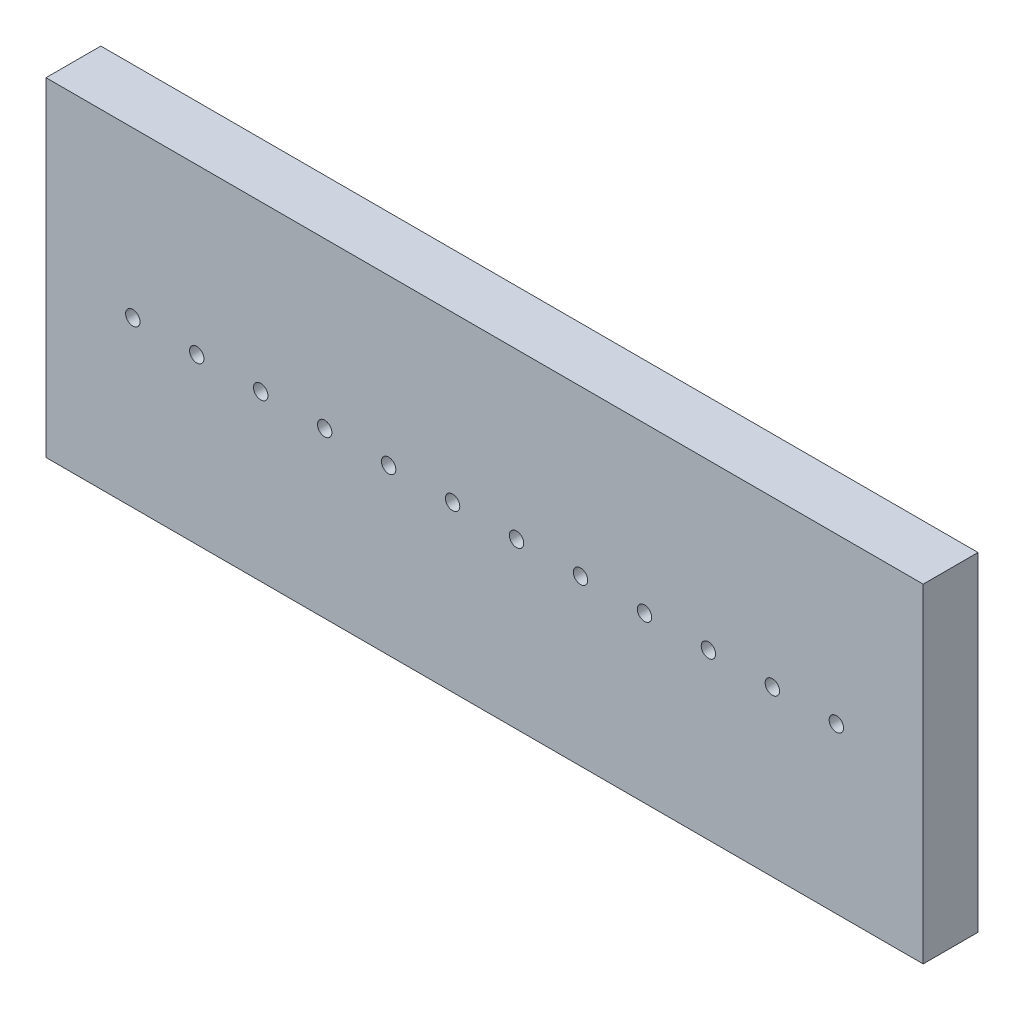
ISO-10303-21;
HEADER;
FILE_DESCRIPTION(('STEP AP214'),'2;1');
FILE_NAME('part.step','',(''),(''),'','','');
FILE_SCHEMA(('AUTOMOTIVE_DESIGN { 1 0 10303 214 1 1 1 1 }'));
ENDSEC;
DATA;
#1=APPLICATION_CONTEXT('core data for automotive mechanical design processes');
#2=APPLICATION_PROTOCOL_DEFINITION('international standard','automotive_design',2000,#1);
#3=PRODUCT_CONTEXT('',#1,'mechanical');
#4=PRODUCT('Part','Part','',(#3));
#5=PRODUCT_RELATED_PRODUCT_CATEGORY('part','',(#4));
#6=PRODUCT_DEFINITION_FORMATION('','',#4);
#7=PRODUCT_DEFINITION_CONTEXT('part definition',#1,'design');
#8=PRODUCT_DEFINITION('design','',#6,#7);
#9=PRODUCT_DEFINITION_SHAPE('','',#8);
#10=(LENGTH_UNIT() NAMED_UNIT(*) SI_UNIT(.MILLI.,.METRE.));
#11=(NAMED_UNIT(*) PLANE_ANGLE_UNIT() SI_UNIT($,.RADIAN.));
#12=(NAMED_UNIT(*) SI_UNIT($,.STERADIAN.) SOLID_ANGLE_UNIT());
#13=UNCERTAINTY_MEASURE_WITH_UNIT(LENGTH_MEASURE(1.E-05),#10,'distance_accuracy_value','');
#14=(GEOMETRIC_REPRESENTATION_CONTEXT(3) GLOBAL_UNCERTAINTY_ASSIGNED_CONTEXT((#13)) GLOBAL_UNIT_ASSIGNED_CONTEXT((#10,
#11,#12)) REPRESENTATION_CONTEXT('',''));
#15=CARTESIAN_POINT('',(0.,0.,0.));
#16=DIRECTION('',(0.,0.,1.));
#17=DIRECTION('',(1.,0.,0.));
#18=AXIS2_PLACEMENT_3D('',#15,#16,#17);
#19=CARTESIAN_POINT('',(101.6,-38.1,12.7));
#20=DIRECTION('',(-1.,0.,0.));
#21=DIRECTION('',(0.,0.,1.));
#22=AXIS2_PLACEMENT_3D('',#19,#20,#21);
#23=PLANE('',#22);
#24=DIRECTION('',(0.,1.,0.));
#25=VECTOR('',#24,1.);
#26=CARTESIAN_POINT('',(101.6,-38.1,0.));
#27=LINE('',#26,#25);
#28=CARTESIAN_POINT('',(101.6,-38.1,0.));
#29=VERTEX_POINT('',#28);
#30=CARTESIAN_POINT('',(101.6,38.1,0.));
#31=VERTEX_POINT('',#30);
#32=EDGE_CURVE('E96',#29,#31,#27,.T.);
#33=ORIENTED_EDGE('',*,*,#32,.T.);
#34=DIRECTION('',(0.,0.,-1.));
#35=VECTOR('',#34,1.);
#36=CARTESIAN_POINT('',(101.6,38.1,12.7));
#37=LINE('',#36,#35);
#38=CARTESIAN_POINT('',(101.6,38.1,12.7));
#39=VERTEX_POINT('',#38);
#40=EDGE_CURVE('E11',#39,#31,#37,.T.);
#41=ORIENTED_EDGE('',*,*,#40,.F.);
#42=DIRECTION('',(0.,1.,0.));
#43=VECTOR('',#42,1.);
#44=CARTESIAN_POINT('',(101.6,-38.1,12.7));
#45=LINE('',#44,#43);
#46=CARTESIAN_POINT('',(101.6,-38.1,12.7));
#47=VERTEX_POINT('',#46);
#48=EDGE_CURVE('E84',#47,#39,#45,.T.);
#49=ORIENTED_EDGE('',*,*,#48,.F.);
#50=DIRECTION('',(0.,0.,-1.));
#51=VECTOR('',#50,1.);
#52=CARTESIAN_POINT('',(101.6,-38.1,12.7));
#53=LINE('',#52,#51);
#54=EDGE_CURVE('E92',#47,#29,#53,.T.);
#55=ORIENTED_EDGE('',*,*,#54,.T.);
#56=EDGE_LOOP('',(#33,#41,#49,#55));
#57=FACE_BOUND('',#56,.T.);
#58=ADVANCED_FACE('F33',(#57),#23,.F.);
#59=CARTESIAN_POINT('',(-101.6,38.1,12.7));
#60=DIRECTION('',(0.,-1.,0.));
#61=DIRECTION('',(0.,0.,-1.));
#62=AXIS2_PLACEMENT_3D('',#59,#60,#61);
#63=PLANE('',#62);
#64=DIRECTION('',(-1.,0.,0.));
#65=VECTOR('',#64,1.);
#66=CARTESIAN_POINT('',(-101.6,38.1,0.));
#67=LINE('',#66,#65);
#68=CARTESIAN_POINT('',(-101.6,38.1,0.));
#69=VERTEX_POINT('',#68);
#70=EDGE_CURVE('E88',#31,#69,#67,.T.);
#71=ORIENTED_EDGE('',*,*,#70,.T.);
#72=DIRECTION('',(0.,0.,-1.));
#73=VECTOR('',#72,1.);
#74=CARTESIAN_POINT('',(-101.6,38.1,12.7));
#75=LINE('',#74,#73);
#76=CARTESIAN_POINT('',(-101.6,38.1,12.7));
#77=VERTEX_POINT('',#76);
#78=EDGE_CURVE('E41',#77,#69,#75,.T.);
#79=ORIENTED_EDGE('',*,*,#78,.F.);
#80=DIRECTION('',(-1.,0.,0.));
#81=VECTOR('',#80,1.);
#82=CARTESIAN_POINT('',(-101.6,38.1,12.7));
#83=LINE('',#82,#81);
#84=EDGE_CURVE('E79',#39,#77,#83,.T.);
#85=ORIENTED_EDGE('',*,*,#84,.F.);
#86=ORIENTED_EDGE('',*,*,#40,.T.);
#87=EDGE_LOOP('',(#71,#79,#85,#86));
#88=FACE_BOUND('',#87,.T.);
#89=ADVANCED_FACE('F87',(#88),#63,.F.);
#90=CARTESIAN_POINT('',(-101.6,-38.1,12.7));
#91=DIRECTION('',(1.,0.,0.));
#92=DIRECTION('',(0.,0.,-1.));
#93=AXIS2_PLACEMENT_3D('',#90,#91,#92);
#94=PLANE('',#93);
#95=DIRECTION('',(0.,-1.,0.));
#96=VECTOR('',#95,1.);
#97=CARTESIAN_POINT('',(-101.6,-38.1,0.));
#98=LINE('',#97,#96);
#99=CARTESIAN_POINT('',(-101.6,-38.1,0.));
#100=VERTEX_POINT('',#99);
#101=EDGE_CURVE('E66',#69,#100,#98,.T.);
#102=ORIENTED_EDGE('',*,*,#101,.T.);
#103=DIRECTION('',(0.,0.,-1.));
#104=VECTOR('',#103,1.);
#105=CARTESIAN_POINT('',(-101.6,-38.1,12.7));
#106=LINE('',#105,#104);
#107=CARTESIAN_POINT('',(-101.6,-38.1,12.7));
#108=VERTEX_POINT('',#107);
#109=EDGE_CURVE('E89',#108,#100,#106,.T.);
#110=ORIENTED_EDGE('',*,*,#109,.F.);
#111=DIRECTION('',(0.,-1.,0.));
#112=VECTOR('',#111,1.);
#113=CARTESIAN_POINT('',(-101.6,-38.1,12.7));
#114=LINE('',#113,#112);
#115=EDGE_CURVE('E82',#77,#108,#114,.T.);
#116=ORIENTED_EDGE('',*,*,#115,.F.);
#117=ORIENTED_EDGE('',*,*,#78,.T.);
#118=EDGE_LOOP('',(#102,#110,#116,#117));
#119=FACE_BOUND('',#118,.T.);
#120=ADVANCED_FACE('F90',(#119),#94,.F.);
#121=CARTESIAN_POINT('',(-101.6,-38.1,12.7));
#122=DIRECTION('',(0.,1.,0.));
#123=DIRECTION('',(0.,0.,1.));
#124=AXIS2_PLACEMENT_3D('',#121,#122,#123);
#125=PLANE('',#124);
#126=DIRECTION('',(1.,0.,0.));
#127=VECTOR('',#126,1.);
#128=CARTESIAN_POINT('',(-101.6,-38.1,0.));
#129=LINE('',#128,#127);
#130=EDGE_CURVE('E72',#100,#29,#129,.T.);
#131=ORIENTED_EDGE('',*,*,#130,.T.);
#132=ORIENTED_EDGE('',*,*,#54,.F.);
#133=DIRECTION('',(1.,0.,0.));
#134=VECTOR('',#133,1.);
#135=CARTESIAN_POINT('',(-101.6,-38.1,12.7));
#136=LINE('',#135,#134);
#137=EDGE_CURVE('E49',#108,#47,#136,.T.);
#138=ORIENTED_EDGE('',*,*,#137,.F.);
#139=ORIENTED_EDGE('',*,*,#109,.T.);
#140=EDGE_LOOP('',(#131,#132,#138,#139));
#141=FACE_BOUND('',#140,.T.);
#142=ADVANCED_FACE('F104',(#141),#125,.F.);
#143=CARTESIAN_POINT('',(0.,0.,12.7));
#144=DIRECTION('',(0.,0.,-1.));
#145=DIRECTION('',(-1.,0.,0.));
#146=AXIS2_PLACEMENT_3D('',#143,#144,#145);
#147=PLANE('',#146);
#148=CARTESIAN_POINT('',(81.4819299999999,0.,12.7));
#149=DIRECTION('',(0.,0.,-1.));
#150=DIRECTION('',(-1.,0.,0.));
#151=AXIS2_PLACEMENT_3D('',#148,#149,#150);
#152=CIRCLE('',#151,1.66687499999962);
#153=CARTESIAN_POINT('',(79.8150550000003,0.,12.7));
#154=VERTEX_POINT('',#153);
#155=EDGE_CURVE('E173',#154,#154,#152,.T.);
#156=ORIENTED_EDGE('',*,*,#155,.T.);
#157=EDGE_LOOP('',(#156));
#158=FACE_BOUND('',#157,.T.);
#159=CARTESIAN_POINT('',(66.66611,-1.02764428708927E-12,12.7));
#160=DIRECTION('',(0.,0.,-1.));
#161=DIRECTION('',(-1.,0.,0.));
#162=AXIS2_PLACEMENT_3D('',#159,#160,#161);
#163=CIRCLE('',#162,1.666875);
#164=CARTESIAN_POINT('',(64.999235,-1.02764428708927E-12,12.7));
#165=VERTEX_POINT('',#164);
#166=EDGE_CURVE('E167',#165,#165,#163,.T.);
#167=ORIENTED_EDGE('',*,*,#166,.T.);
#168=EDGE_LOOP('',(#167));
#169=FACE_BOUND('',#168,.T.);
#170=CARTESIAN_POINT('',(51.85029,-9.24185968989952E-13,12.7));
#171=DIRECTION('',(0.,0.,-1.));
#172=DIRECTION('',(-1.,0.,0.));
#173=AXIS2_PLACEMENT_3D('',#170,#171,#172);
#174=CIRCLE('',#173,1.666875);
#175=CARTESIAN_POINT('',(50.183415,-9.24185968989952E-13,12.7));
#176=VERTEX_POINT('',#175);
#177=EDGE_CURVE('E161',#176,#176,#174,.T.);
#178=ORIENTED_EDGE('',*,*,#177,.T.);
#179=EDGE_LOOP('',(#178));
#180=FACE_BOUND('',#179,.T.);
#181=CARTESIAN_POINT('',(37.03447,-8.20727650890635E-13,12.7));
#182=DIRECTION('',(0.,0.,-1.));
#183=DIRECTION('',(-1.,0.,0.));
#184=AXIS2_PLACEMENT_3D('',#181,#182,#183);
#185=CIRCLE('',#184,1.666875);
#186=CARTESIAN_POINT('',(35.367595,-8.20727650890635E-13,12.7));
#187=VERTEX_POINT('',#186);
#188=EDGE_CURVE('E155',#187,#187,#185,.T.);
#189=ORIENTED_EDGE('',*,*,#188,.T.);
#190=EDGE_LOOP('',(#189));
#191=FACE_BOUND('',#190,.T.);
#192=CARTESIAN_POINT('',(22.21865,-7.17269332791317E-13,12.7));
#193=DIRECTION('',(0.,0.,-1.));
#194=DIRECTION('',(-1.,0.,0.));
#195=AXIS2_PLACEMENT_3D('',#192,#193,#194);
#196=CIRCLE('',#195,1.666875);
#197=CARTESIAN_POINT('',(20.551775,-7.17269332791317E-13,12.7));
#198=VERTEX_POINT('',#197);
#199=EDGE_CURVE('E149',#198,#198,#196,.T.);
#200=ORIENTED_EDGE('',*,*,#199,.T.);
#201=EDGE_LOOP('',(#200));
#202=FACE_BOUND('',#201,.T.);
#203=CARTESIAN_POINT('',(7.40283,-6.13811014691999E-13,12.7));
#204=DIRECTION('',(0.,0.,-1.));
#205=DIRECTION('',(-1.,0.,0.));
#206=AXIS2_PLACEMENT_3D('',#203,#204,#205);
#207=CIRCLE('',#206,1.666875);
#208=CARTESIAN_POINT('',(5.735955,-6.13811014691999E-13,12.7));
#209=VERTEX_POINT('',#208);
#210=EDGE_CURVE('E143',#209,#209,#207,.T.);
#211=ORIENTED_EDGE('',*,*,#210,.T.);
#212=EDGE_LOOP('',(#211));
#213=FACE_BOUND('',#212,.T.);
#214=CARTESIAN_POINT('',(-7.41298999999999,-5.10352696592681E-13,12.7));
#215=DIRECTION('',(0.,0.,-1.));
#216=DIRECTION('',(-1.,0.,0.));
#217=AXIS2_PLACEMENT_3D('',#214,#215,#216);
#218=CIRCLE('',#217,1.666875);
#219=CARTESIAN_POINT('',(-9.079865,-5.10352696592681E-13,12.7));
#220=VERTEX_POINT('',#219);
#221=EDGE_CURVE('E137',#220,#220,#218,.T.);
#222=ORIENTED_EDGE('',*,*,#221,.T.);
#223=EDGE_LOOP('',(#222));
#224=FACE_BOUND('',#223,.T.);
#225=CARTESIAN_POINT('',(-22.22881,-4.06894378493364E-13,12.7));
#226=DIRECTION('',(0.,0.,-1.));
#227=DIRECTION('',(-1.,0.,0.));
#228=AXIS2_PLACEMENT_3D('',#225,#226,#227);
#229=CIRCLE('',#228,1.666875);
#230=CARTESIAN_POINT('',(-23.895685,-4.06894378493364E-13,12.7));
#231=VERTEX_POINT('',#230);
#232=EDGE_CURVE('E131',#231,#231,#229,.T.);
#233=ORIENTED_EDGE('',*,*,#232,.T.);
#234=EDGE_LOOP('',(#233));
#235=FACE_BOUND('',#234,.T.);
#236=CARTESIAN_POINT('',(-37.04463,-3.03436060394046E-13,12.7));
#237=DIRECTION('',(0.,0.,-1.));
#238=DIRECTION('',(-1.,0.,0.));
#239=AXIS2_PLACEMENT_3D('',#236,#237,#238);
#240=CIRCLE('',#239,1.666875);
#241=CARTESIAN_POINT('',(-38.711505,-3.03436060394046E-13,12.7));
#242=VERTEX_POINT('',#241);
#243=EDGE_CURVE('E125',#242,#242,#240,.T.);
#244=ORIENTED_EDGE('',*,*,#243,.T.);
#245=EDGE_LOOP('',(#244));
#246=FACE_BOUND('',#245,.T.);
#247=CARTESIAN_POINT('',(-51.86045,-1.99977742294728E-13,12.7));
#248=DIRECTION('',(0.,0.,-1.));
#249=DIRECTION('',(-1.,0.,0.));
#250=AXIS2_PLACEMENT_3D('',#247,#248,#249);
#251=CIRCLE('',#250,1.666875);
#252=CARTESIAN_POINT('',(-53.527325,-1.99977742294728E-13,12.7));
#253=VERTEX_POINT('',#252);
#254=EDGE_CURVE('E119',#253,#253,#251,.T.);
#255=ORIENTED_EDGE('',*,*,#254,.T.);
#256=EDGE_LOOP('',(#255));
#257=FACE_BOUND('',#256,.T.);
#258=CARTESIAN_POINT('',(-66.67627,0.,12.7));
#259=DIRECTION('',(0.,0.,-1.));
#260=DIRECTION('',(-1.,0.,0.));
#261=AXIS2_PLACEMENT_3D('',#258,#259,#260);
#262=CIRCLE('',#261,1.66687499999999);
#263=CARTESIAN_POINT('',(-68.343145,0.,12.7));
#264=VERTEX_POINT('',#263);
#265=EDGE_CURVE('E113',#264,#264,#262,.T.);
#266=ORIENTED_EDGE('',*,*,#265,.T.);
#267=EDGE_LOOP('',(#266));
#268=FACE_BOUND('',#267,.T.);
#269=CARTESIAN_POINT('',(-81.49209,0.,12.7));
#270=DIRECTION('',(0.,0.,-1.));
#271=DIRECTION('',(-1.,0.,0.));
#272=AXIS2_PLACEMENT_3D('',#269,#270,#271);
#273=CIRCLE('',#272,1.666875);
#274=CARTESIAN_POINT('',(-83.158965,0.,12.7));
#275=VERTEX_POINT('',#274);
#276=EDGE_CURVE('E99',#275,#275,#273,.T.);
#277=ORIENTED_EDGE('',*,*,#276,.T.);
#278=EDGE_LOOP('',(#277));
#279=FACE_BOUND('',#278,.T.);
#280=ORIENTED_EDGE('',*,*,#48,.T.);
#281=ORIENTED_EDGE('',*,*,#84,.T.);
#282=ORIENTED_EDGE('',*,*,#115,.T.);
#283=ORIENTED_EDGE('',*,*,#137,.T.);
#284=EDGE_LOOP('',(#280,#281,#282,#283));
#285=FACE_BOUND('',#284,.T.);
#286=ADVANCED_FACE('F80',(#158,#169,#180,#191,#202,#213,#224,#235,#246,#257,#268,#279,#285),
#147,.F.);
#287=CARTESIAN_POINT('',(0.,0.,0.));
#288=DIRECTION('',(0.,0.,-1.));
#289=DIRECTION('',(-1.,0.,0.));
#290=AXIS2_PLACEMENT_3D('',#287,#288,#289);
#291=PLANE('',#290);
#292=CARTESIAN_POINT('',(81.4819299999999,0.,0.));
#293=DIRECTION('',(0.,0.,-1.));
#294=DIRECTION('',(-1.,0.,0.));
#295=AXIS2_PLACEMENT_3D('',#292,#293,#294);
#296=CIRCLE('',#295,1.66687499999962);
#297=CARTESIAN_POINT('',(79.8150550000003,0.,0.));
#298=VERTEX_POINT('',#297);
#299=EDGE_CURVE('E176',#298,#298,#296,.T.);
#300=ORIENTED_EDGE('',*,*,#299,.F.);
#301=EDGE_LOOP('',(#300));
#302=FACE_BOUND('',#301,.T.);
#303=CARTESIAN_POINT('',(66.66611,-1.02764428708927E-12,0.));
#304=DIRECTION('',(0.,0.,-1.));
#305=DIRECTION('',(-1.,0.,0.));
#306=AXIS2_PLACEMENT_3D('',#303,#304,#305);
#307=CIRCLE('',#306,1.666875);
#308=CARTESIAN_POINT('',(64.999235,-1.02764428708927E-12,0.));
#309=VERTEX_POINT('',#308);
#310=EDGE_CURVE('E170',#309,#309,#307,.T.);
#311=ORIENTED_EDGE('',*,*,#310,.F.);
#312=EDGE_LOOP('',(#311));
#313=FACE_BOUND('',#312,.T.);
#314=CARTESIAN_POINT('',(51.85029,-9.24185968989952E-13,0.));
#315=DIRECTION('',(0.,0.,-1.));
#316=DIRECTION('',(-1.,0.,0.));
#317=AXIS2_PLACEMENT_3D('',#314,#315,#316);
#318=CIRCLE('',#317,1.666875);
#319=CARTESIAN_POINT('',(50.183415,-9.24185968989952E-13,0.));
#320=VERTEX_POINT('',#319);
#321=EDGE_CURVE('E164',#320,#320,#318,.T.);
#322=ORIENTED_EDGE('',*,*,#321,.F.);
#323=EDGE_LOOP('',(#322));
#324=FACE_BOUND('',#323,.T.);
#325=CARTESIAN_POINT('',(37.03447,-8.20727650890635E-13,0.));
#326=DIRECTION('',(0.,0.,-1.));
#327=DIRECTION('',(-1.,0.,0.));
#328=AXIS2_PLACEMENT_3D('',#325,#326,#327);
#329=CIRCLE('',#328,1.666875);
#330=CARTESIAN_POINT('',(35.367595,-8.20727650890635E-13,0.));
#331=VERTEX_POINT('',#330);
#332=EDGE_CURVE('E158',#331,#331,#329,.T.);
#333=ORIENTED_EDGE('',*,*,#332,.F.);
#334=EDGE_LOOP('',(#333));
#335=FACE_BOUND('',#334,.T.);
#336=CARTESIAN_POINT('',(22.21865,-7.17269332791317E-13,0.));
#337=DIRECTION('',(0.,0.,-1.));
#338=DIRECTION('',(-1.,0.,0.));
#339=AXIS2_PLACEMENT_3D('',#336,#337,#338);
#340=CIRCLE('',#339,1.666875);
#341=CARTESIAN_POINT('',(20.551775,-7.17269332791317E-13,0.));
#342=VERTEX_POINT('',#341);
#343=EDGE_CURVE('E152',#342,#342,#340,.T.);
#344=ORIENTED_EDGE('',*,*,#343,.F.);
#345=EDGE_LOOP('',(#344));
#346=FACE_BOUND('',#345,.T.);
#347=CARTESIAN_POINT('',(7.40283,-6.13811014691999E-13,0.));
#348=DIRECTION('',(0.,0.,-1.));
#349=DIRECTION('',(-1.,0.,0.));
#350=AXIS2_PLACEMENT_3D('',#347,#348,#349);
#351=CIRCLE('',#350,1.666875);
#352=CARTESIAN_POINT('',(5.735955,-6.13811014691999E-13,0.));
#353=VERTEX_POINT('',#352);
#354=EDGE_CURVE('E146',#353,#353,#351,.T.);
#355=ORIENTED_EDGE('',*,*,#354,.F.);
#356=EDGE_LOOP('',(#355));
#357=FACE_BOUND('',#356,.T.);
#358=CARTESIAN_POINT('',(-7.41298999999999,-5.10352696592681E-13,0.));
#359=DIRECTION('',(0.,0.,-1.));
#360=DIRECTION('',(-1.,0.,0.));
#361=AXIS2_PLACEMENT_3D('',#358,#359,#360);
#362=CIRCLE('',#361,1.666875);
#363=CARTESIAN_POINT('',(-9.079865,-5.10352696592681E-13,0.));
#364=VERTEX_POINT('',#363);
#365=EDGE_CURVE('E140',#364,#364,#362,.T.);
#366=ORIENTED_EDGE('',*,*,#365,.F.);
#367=EDGE_LOOP('',(#366));
#368=FACE_BOUND('',#367,.T.);
#369=CARTESIAN_POINT('',(-22.22881,-4.06894378493364E-13,0.));
#370=DIRECTION('',(0.,0.,-1.));
#371=DIRECTION('',(-1.,0.,0.));
#372=AXIS2_PLACEMENT_3D('',#369,#370,#371);
#373=CIRCLE('',#372,1.666875);
#374=CARTESIAN_POINT('',(-23.895685,-4.06894378493364E-13,0.));
#375=VERTEX_POINT('',#374);
#376=EDGE_CURVE('E134',#375,#375,#373,.T.);
#377=ORIENTED_EDGE('',*,*,#376,.F.);
#378=EDGE_LOOP('',(#377));
#379=FACE_BOUND('',#378,.T.);
#380=CARTESIAN_POINT('',(-37.04463,-3.03436060394046E-13,0.));
#381=DIRECTION('',(0.,0.,-1.));
#382=DIRECTION('',(-1.,0.,0.));
#383=AXIS2_PLACEMENT_3D('',#380,#381,#382);
#384=CIRCLE('',#383,1.666875);
#385=CARTESIAN_POINT('',(-38.711505,-3.03436060394046E-13,0.));
#386=VERTEX_POINT('',#385);
#387=EDGE_CURVE('E128',#386,#386,#384,.T.);
#388=ORIENTED_EDGE('',*,*,#387,.F.);
#389=EDGE_LOOP('',(#388));
#390=FACE_BOUND('',#389,.T.);
#391=CARTESIAN_POINT('',(-51.86045,-1.99977742294728E-13,0.));
#392=DIRECTION('',(0.,0.,-1.));
#393=DIRECTION('',(-1.,0.,0.));
#394=AXIS2_PLACEMENT_3D('',#391,#392,#393);
#395=CIRCLE('',#394,1.666875);
#396=CARTESIAN_POINT('',(-53.527325,-1.99977742294728E-13,0.));
#397=VERTEX_POINT('',#396);
#398=EDGE_CURVE('E122',#397,#397,#395,.T.);
#399=ORIENTED_EDGE('',*,*,#398,.F.);
#400=EDGE_LOOP('',(#399));
#401=FACE_BOUND('',#400,.T.);
#402=CARTESIAN_POINT('',(-66.67627,0.,0.));
#403=DIRECTION('',(0.,0.,-1.));
#404=DIRECTION('',(-1.,0.,0.));
#405=AXIS2_PLACEMENT_3D('',#402,#403,#404);
#406=CIRCLE('',#405,1.66687499999999);
#407=CARTESIAN_POINT('',(-68.343145,0.,0.));
#408=VERTEX_POINT('',#407);
#409=EDGE_CURVE('E116',#408,#408,#406,.T.);
#410=ORIENTED_EDGE('',*,*,#409,.F.);
#411=EDGE_LOOP('',(#410));
#412=FACE_BOUND('',#411,.T.);
#413=CARTESIAN_POINT('',(-81.49209,0.,0.));
#414=DIRECTION('',(0.,0.,-1.));
#415=DIRECTION('',(-1.,0.,0.));
#416=AXIS2_PLACEMENT_3D('',#413,#414,#415);
#417=CIRCLE('',#416,1.666875);
#418=CARTESIAN_POINT('',(-83.158965,0.,0.));
#419=VERTEX_POINT('',#418);
#420=EDGE_CURVE('E110',#419,#419,#417,.T.);
#421=ORIENTED_EDGE('',*,*,#420,.F.);
#422=EDGE_LOOP('',(#421));
#423=FACE_BOUND('',#422,.T.);
#424=ORIENTED_EDGE('',*,*,#32,.F.);
#425=ORIENTED_EDGE('',*,*,#130,.F.);
#426=ORIENTED_EDGE('',*,*,#101,.F.);
#427=ORIENTED_EDGE('',*,*,#70,.F.);
#428=EDGE_LOOP('',(#424,#425,#426,#427));
#429=FACE_BOUND('',#428,.T.);
#430=ADVANCED_FACE('F107',(#302,#313,#324,#335,#346,#357,#368,#379,#390,#401,#412,#423,#429),
#291,.T.);
#431=CARTESIAN_POINT('',(-81.49209,0.,12.7));
#432=DIRECTION('',(0.,0.,-1.));
#433=DIRECTION('',(-1.,0.,0.));
#434=AXIS2_PLACEMENT_3D('',#431,#432,#433);
#435=CYLINDRICAL_SURFACE('',#434,1.666875);
#436=ORIENTED_EDGE('',*,*,#276,.F.);
#437=EDGE_LOOP('',(#436));
#438=FACE_BOUND('',#437,.T.);
#439=ORIENTED_EDGE('',*,*,#420,.T.);
#440=EDGE_LOOP('',(#439));
#441=FACE_BOUND('',#440,.T.);
#442=ADVANCED_FACE('F193',(#438,#441),#435,.F.);
#443=CARTESIAN_POINT('',(-66.67627,0.,12.7));
#444=DIRECTION('',(0.,0.,-1.));
#445=DIRECTION('',(-1.,0.,0.));
#446=AXIS2_PLACEMENT_3D('',#443,#444,#445);
#447=CYLINDRICAL_SURFACE('',#446,1.66687499999999);
#448=ORIENTED_EDGE('',*,*,#265,.F.);
#449=EDGE_LOOP('',(#448));
#450=FACE_BOUND('',#449,.T.);
#451=ORIENTED_EDGE('',*,*,#409,.T.);
#452=EDGE_LOOP('',(#451));
#453=FACE_BOUND('',#452,.T.);
#454=ADVANCED_FACE('F218',(#450,#453),#447,.F.);
#455=CARTESIAN_POINT('',(-51.86045,-1.99977742294728E-13,12.7));
#456=DIRECTION('',(0.,0.,-1.));
#457=DIRECTION('',(-1.,0.,0.));
#458=AXIS2_PLACEMENT_3D('',#455,#456,#457);
#459=CYLINDRICAL_SURFACE('',#458,1.666875);
#460=ORIENTED_EDGE('',*,*,#254,.F.);
#461=EDGE_LOOP('',(#460));
#462=FACE_BOUND('',#461,.T.);
#463=ORIENTED_EDGE('',*,*,#398,.T.);
#464=EDGE_LOOP('',(#463));
#465=FACE_BOUND('',#464,.T.);
#466=ADVANCED_FACE('F225',(#462,#465),#459,.F.);
#467=CARTESIAN_POINT('',(-37.04463,-3.03436060394046E-13,12.7));
#468=DIRECTION('',(0.,0.,-1.));
#469=DIRECTION('',(-1.,0.,0.));
#470=AXIS2_PLACEMENT_3D('',#467,#468,#469);
#471=CYLINDRICAL_SURFACE('',#470,1.666875);
#472=ORIENTED_EDGE('',*,*,#243,.F.);
#473=EDGE_LOOP('',(#472));
#474=FACE_BOUND('',#473,.T.);
#475=ORIENTED_EDGE('',*,*,#387,.T.);
#476=EDGE_LOOP('',(#475));
#477=FACE_BOUND('',#476,.T.);
#478=ADVANCED_FACE('F267',(#474,#477),#471,.F.);
#479=CARTESIAN_POINT('',(-22.22881,-4.06894378493364E-13,12.7));
#480=DIRECTION('',(0.,0.,-1.));
#481=DIRECTION('',(-1.,0.,0.));
#482=AXIS2_PLACEMENT_3D('',#479,#480,#481);
#483=CYLINDRICAL_SURFACE('',#482,1.666875);
#484=ORIENTED_EDGE('',*,*,#232,.F.);
#485=EDGE_LOOP('',(#484));
#486=FACE_BOUND('',#485,.T.);
#487=ORIENTED_EDGE('',*,*,#376,.T.);
#488=EDGE_LOOP('',(#487));
#489=FACE_BOUND('',#488,.T.);
#490=ADVANCED_FACE('F277',(#486,#489),#483,.F.);
#491=CARTESIAN_POINT('',(-7.41298999999999,-5.10352696592681E-13,12.7));
#492=DIRECTION('',(0.,0.,-1.));
#493=DIRECTION('',(-1.,0.,0.));
#494=AXIS2_PLACEMENT_3D('',#491,#492,#493);
#495=CYLINDRICAL_SURFACE('',#494,1.666875);
#496=ORIENTED_EDGE('',*,*,#221,.F.);
#497=EDGE_LOOP('',(#496));
#498=FACE_BOUND('',#497,.T.);
#499=ORIENTED_EDGE('',*,*,#365,.T.);
#500=EDGE_LOOP('',(#499));
#501=FACE_BOUND('',#500,.T.);
#502=ADVANCED_FACE('F287',(#498,#501),#495,.F.);
#503=CARTESIAN_POINT('',(7.40283,-6.13811014691999E-13,12.7));
#504=DIRECTION('',(0.,0.,-1.));
#505=DIRECTION('',(-1.,0.,0.));
#506=AXIS2_PLACEMENT_3D('',#503,#504,#505);
#507=CYLINDRICAL_SURFACE('',#506,1.666875);
#508=ORIENTED_EDGE('',*,*,#210,.F.);
#509=EDGE_LOOP('',(#508));
#510=FACE_BOUND('',#509,.T.);
#511=ORIENTED_EDGE('',*,*,#354,.T.);
#512=EDGE_LOOP('',(#511));
#513=FACE_BOUND('',#512,.T.);
#514=ADVANCED_FACE('F297',(#510,#513),#507,.F.);
#515=CARTESIAN_POINT('',(22.21865,-7.17269332791317E-13,12.7));
#516=DIRECTION('',(0.,0.,-1.));
#517=DIRECTION('',(-1.,0.,0.));
#518=AXIS2_PLACEMENT_3D('',#515,#516,#517);
#519=CYLINDRICAL_SURFACE('',#518,1.666875);
#520=ORIENTED_EDGE('',*,*,#199,.F.);
#521=EDGE_LOOP('',(#520));
#522=FACE_BOUND('',#521,.T.);
#523=ORIENTED_EDGE('',*,*,#343,.T.);
#524=EDGE_LOOP('',(#523));
#525=FACE_BOUND('',#524,.T.);
#526=ADVANCED_FACE('F307',(#522,#525),#519,.F.);
#527=CARTESIAN_POINT('',(37.03447,-8.20727650890635E-13,12.7));
#528=DIRECTION('',(0.,0.,-1.));
#529=DIRECTION('',(-1.,0.,0.));
#530=AXIS2_PLACEMENT_3D('',#527,#528,#529);
#531=CYLINDRICAL_SURFACE('',#530,1.666875);
#532=ORIENTED_EDGE('',*,*,#188,.F.);
#533=EDGE_LOOP('',(#532));
#534=FACE_BOUND('',#533,.T.);
#535=ORIENTED_EDGE('',*,*,#332,.T.);
#536=EDGE_LOOP('',(#535));
#537=FACE_BOUND('',#536,.T.);
#538=ADVANCED_FACE('F317',(#534,#537),#531,.F.);
#539=CARTESIAN_POINT('',(51.85029,-9.24185968989952E-13,12.7));
#540=DIRECTION('',(0.,0.,-1.));
#541=DIRECTION('',(-1.,0.,0.));
#542=AXIS2_PLACEMENT_3D('',#539,#540,#541);
#543=CYLINDRICAL_SURFACE('',#542,1.666875);
#544=ORIENTED_EDGE('',*,*,#177,.F.);
#545=EDGE_LOOP('',(#544));
#546=FACE_BOUND('',#545,.T.);
#547=ORIENTED_EDGE('',*,*,#321,.T.);
#548=EDGE_LOOP('',(#547));
#549=FACE_BOUND('',#548,.T.);
#550=ADVANCED_FACE('F327',(#546,#549),#543,.F.);
#551=CARTESIAN_POINT('',(66.66611,-1.02764428708927E-12,12.7));
#552=DIRECTION('',(0.,0.,-1.));
#553=DIRECTION('',(-1.,0.,0.));
#554=AXIS2_PLACEMENT_3D('',#551,#552,#553);
#555=CYLINDRICAL_SURFACE('',#554,1.666875);
#556=ORIENTED_EDGE('',*,*,#166,.F.);
#557=EDGE_LOOP('',(#556));
#558=FACE_BOUND('',#557,.T.);
#559=ORIENTED_EDGE('',*,*,#310,.T.);
#560=EDGE_LOOP('',(#559));
#561=FACE_BOUND('',#560,.T.);
#562=ADVANCED_FACE('F187',(#558,#561),#555,.F.);
#563=CARTESIAN_POINT('',(81.4819299999999,0.,12.7));
#564=DIRECTION('',(0.,0.,-1.));
#565=DIRECTION('',(-1.,0.,0.));
#566=AXIS2_PLACEMENT_3D('',#563,#564,#565);
#567=CYLINDRICAL_SURFACE('',#566,1.66687499999962);
#568=ORIENTED_EDGE('',*,*,#155,.F.);
#569=EDGE_LOOP('',(#568));
#570=FACE_BOUND('',#569,.T.);
#571=ORIENTED_EDGE('',*,*,#299,.T.);
#572=EDGE_LOOP('',(#571));
#573=FACE_BOUND('',#572,.T.);
#574=ADVANCED_FACE('F184',(#570,#573),#567,.F.);
#575=CLOSED_SHELL('',(#58,#89,#120,#142,#286,#430,#442,#454,#466,#478,#490,#502,#514,#526,#538,
#550,#562,#574));
#576=MANIFOLD_SOLID_BREP('B2',#575);
#577=ADVANCED_BREP_SHAPE_REPRESENTATION('',(#18,#576),#14);
#578=SHAPE_DEFINITION_REPRESENTATION(#9,#577);
ENDSEC;
END-ISO-10303-21;
